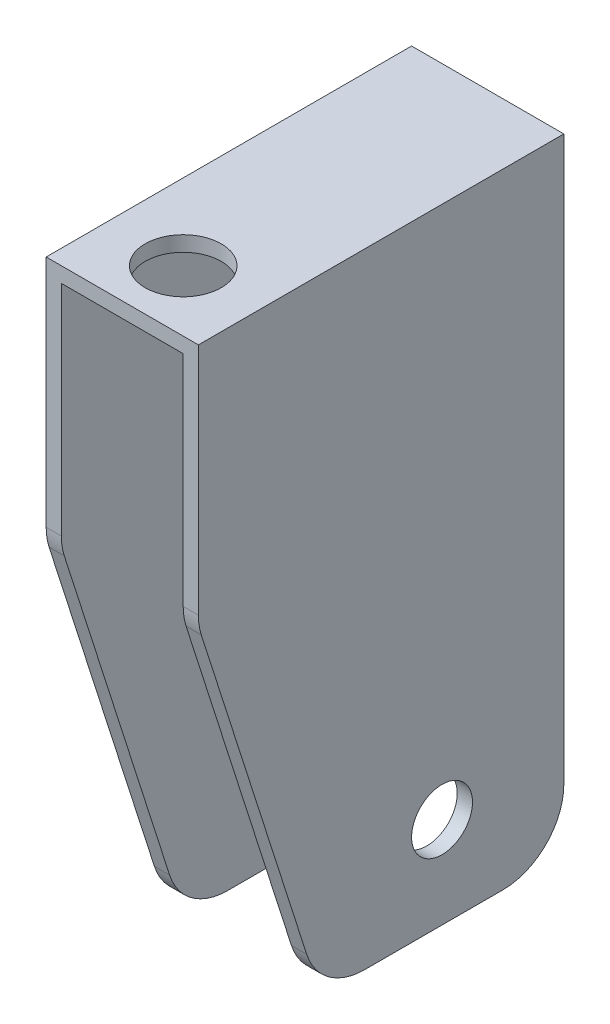
ISO-10303-21;
HEADER;
FILE_DESCRIPTION(('STEP AP214'),'2;1');
FILE_NAME('part.step','',(''),(''),'','','');
FILE_SCHEMA(('AUTOMOTIVE_DESIGN { 1 0 10303 214 1 1 1 1 }'));
ENDSEC;
DATA;
#1=APPLICATION_CONTEXT('core data for automotive mechanical design processes');
#2=APPLICATION_PROTOCOL_DEFINITION('international standard','automotive_design',2000,#1);
#3=PRODUCT_CONTEXT('',#1,'mechanical');
#4=PRODUCT('Part','Part','',(#3));
#5=PRODUCT_RELATED_PRODUCT_CATEGORY('part','',(#4));
#6=PRODUCT_DEFINITION_FORMATION('','',#4);
#7=PRODUCT_DEFINITION_CONTEXT('part definition',#1,'design');
#8=PRODUCT_DEFINITION('design','',#6,#7);
#9=PRODUCT_DEFINITION_SHAPE('','',#8);
#10=(LENGTH_UNIT() NAMED_UNIT(*) SI_UNIT(.MILLI.,.METRE.));
#11=(NAMED_UNIT(*) PLANE_ANGLE_UNIT() SI_UNIT($,.RADIAN.));
#12=(NAMED_UNIT(*) SI_UNIT($,.STERADIAN.) SOLID_ANGLE_UNIT());
#13=UNCERTAINTY_MEASURE_WITH_UNIT(LENGTH_MEASURE(1.E-05),#10,'distance_accuracy_value','');
#14=(GEOMETRIC_REPRESENTATION_CONTEXT(3) GLOBAL_UNCERTAINTY_ASSIGNED_CONTEXT((#13)) GLOBAL_UNIT_ASSIGNED_CONTEXT((#10,
#11,#12)) REPRESENTATION_CONTEXT('',''));
#15=CARTESIAN_POINT('',(0.,0.,0.));
#16=DIRECTION('',(0.,0.,1.));
#17=DIRECTION('',(1.,0.,0.));
#18=AXIS2_PLACEMENT_3D('',#15,#16,#17);
#19=CARTESIAN_POINT('',(0.,0.,120.));
#20=DIRECTION('',(0.,1.,0.));
#21=DIRECTION('',(0.,0.,1.));
#22=AXIS2_PLACEMENT_3D('',#19,#20,#21);
#23=PLANE('',#22);
#24=DIRECTION('',(0.,0.,-1.));
#25=VECTOR('',#24,1.);
#26=CARTESIAN_POINT('',(5.,0.,120.));
#27=LINE('',#26,#25);
#28=CARTESIAN_POINT('',(5.,0.,65.4009524025493));
#29=VERTEX_POINT('',#28);
#30=CARTESIAN_POINT('',(5.,0.,20.));
#31=VERTEX_POINT('',#30);
#32=EDGE_CURVE('E165',#29,#31,#27,.T.);
#33=ORIENTED_EDGE('',*,*,#32,.F.);
#34=DIRECTION('',(1.,0.,0.));
#35=VECTOR('',#34,1.);
#36=CARTESIAN_POINT('',(0.,0.,65.4009524025493));
#37=LINE('',#36,#35);
#38=CARTESIAN_POINT('',(0.,0.,65.4009524025493));
#39=VERTEX_POINT('',#38);
#40=EDGE_CURVE('E260',#29,#39,#37,.F.);
#41=ORIENTED_EDGE('',*,*,#40,.T.);
#42=DIRECTION('',(0.,0.,-1.));
#43=VECTOR('',#42,1.);
#44=CARTESIAN_POINT('',(0.,0.,120.));
#45=LINE('',#44,#43);
#46=CARTESIAN_POINT('',(0.,0.,20.));
#47=VERTEX_POINT('',#46);
#48=EDGE_CURVE('E234',#39,#47,#45,.T.);
#49=ORIENTED_EDGE('',*,*,#48,.T.);
#50=DIRECTION('',(1.,0.,0.));
#51=VECTOR('',#50,1.);
#52=CARTESIAN_POINT('',(0.,0.,20.));
#53=LINE('',#52,#51);
#54=EDGE_CURVE('E262',#47,#31,#53,.T.);
#55=ORIENTED_EDGE('',*,*,#54,.T.);
#56=EDGE_LOOP('',(#33,#41,#49,#55));
#57=FACE_BOUND('',#56,.T.);
#58=ADVANCED_FACE('F33',(#57),#23,.F.);
#59=CARTESIAN_POINT('',(5.,0.,120.));
#60=DIRECTION('',(-1.,0.,0.));
#61=DIRECTION('',(0.,0.,1.));
#62=AXIS2_PLACEMENT_3D('',#59,#60,#61);
#63=PLANE('',#62);
#64=CARTESIAN_POINT('',(5.,30.,40.));
#65=DIRECTION('',(-1.,0.,0.));
#66=DIRECTION('',(0.,0.,1.));
#67=AXIS2_PLACEMENT_3D('',#64,#65,#66);
#68=CIRCLE('',#67,10.);
#69=CARTESIAN_POINT('',(5.,30.,50.));
#70=VERTEX_POINT('',#69);
#71=EDGE_CURVE('E324',#70,#70,#68,.T.);
#72=ORIENTED_EDGE('',*,*,#71,.T.);
#73=EDGE_LOOP('',(#72));
#74=FACE_BOUND('',#73,.T.);
#75=DIRECTION('',(0.,1.,0.));
#76=VECTOR('',#75,1.);
#77=CARTESIAN_POINT('',(5.,0.,120.));
#78=LINE('',#77,#76);
#79=CARTESIAN_POINT('',(5.,128.122023742033,120.));
#80=VERTEX_POINT('',#79);
#81=CARTESIAN_POINT('',(5.,200.,120.));
#82=VERTEX_POINT('',#81);
#83=EDGE_CURVE('E145',#80,#82,#78,.T.);
#84=ORIENTED_EDGE('',*,*,#83,.F.);
#85=CARTESIAN_POINT('',(5.,128.122023742033,100.));
#86=DIRECTION('',(-1.,0.,0.));
#87=DIRECTION('',(0.,0.,1.));
#88=AXIS2_PLACEMENT_3D('',#85,#86,#87);
#89=CIRCLE('',#88,20.);
#90=CARTESIAN_POINT('',(5.,122.026509199958,119.048482943986));
#91=VERTEX_POINT('',#90);
#92=EDGE_CURVE('E191',#80,#91,#89,.F.);
#93=ORIENTED_EDGE('',*,*,#92,.T.);
#94=DIRECTION('',(0.,-0.952424147199324,-0.304775727103784));
#95=VECTOR('',#94,1.);
#96=CARTESIAN_POINT('',(5.,11.611030478955,83.7155297532656));
#97=LINE('',#96,#95);
#98=CARTESIAN_POINT('',(5.,13.9044854579243,84.4494353465358));
#99=VERTEX_POINT('',#98);
#100=EDGE_CURVE('E217',#91,#99,#97,.T.);
#101=ORIENTED_EDGE('',*,*,#100,.T.);
#102=CARTESIAN_POINT('',(5.,20.,65.4009524025493));
#103=DIRECTION('',(-1.,0.,0.));
#104=DIRECTION('',(0.,0.,1.));
#105=AXIS2_PLACEMENT_3D('',#102,#103,#104);
#106=CIRCLE('',#105,20.);
#107=EDGE_CURVE('E189',#99,#29,#106,.F.);
#108=ORIENTED_EDGE('',*,*,#107,.T.);
#109=ORIENTED_EDGE('',*,*,#32,.T.);
#110=CARTESIAN_POINT('',(5.,20.,20.));
#111=DIRECTION('',(-1.,0.,0.));
#112=DIRECTION('',(0.,0.,1.));
#113=AXIS2_PLACEMENT_3D('',#110,#111,#112);
#114=CIRCLE('',#113,20.);
#115=CARTESIAN_POINT('',(5.,20.,0.));
#116=VERTEX_POINT('',#115);
#117=EDGE_CURVE('E187',#31,#116,#114,.F.);
#118=ORIENTED_EDGE('',*,*,#117,.T.);
#119=DIRECTION('',(0.,1.,0.));
#120=VECTOR('',#119,1.);
#121=CARTESIAN_POINT('',(5.,0.,0.));
#122=LINE('',#121,#120);
#123=CARTESIAN_POINT('',(5.,200.,0.));
#124=VERTEX_POINT('',#123);
#125=EDGE_CURVE('E162',#116,#124,#122,.T.);
#126=ORIENTED_EDGE('',*,*,#125,.T.);
#127=DIRECTION('',(0.,0.,-1.));
#128=VECTOR('',#127,1.);
#129=CARTESIAN_POINT('',(5.,200.,120.));
#130=LINE('',#129,#128);
#131=EDGE_CURVE('E159',#82,#124,#130,.T.);
#132=ORIENTED_EDGE('',*,*,#131,.F.);
#133=EDGE_LOOP('',(#84,#93,#101,#108,#109,#118,#126,#132));
#134=FACE_BOUND('',#133,.T.);
#135=ADVANCED_FACE('F160',(#74,#134),#63,.F.);
#136=CARTESIAN_POINT('',(5.,200.,120.));
#137=DIRECTION('',(0.,1.,0.));
#138=DIRECTION('',(0.,0.,1.));
#139=AXIS2_PLACEMENT_3D('',#136,#137,#138);
#140=PLANE('',#139);
#141=CARTESIAN_POINT('',(25.,200.,100.));
#142=DIRECTION('',(0.,1.,0.));
#143=DIRECTION('',(0.,0.,1.));
#144=AXIS2_PLACEMENT_3D('',#141,#142,#143);
#145=CIRCLE('',#144,12.5);
#146=CARTESIAN_POINT('',(25.,200.,112.5));
#147=VERTEX_POINT('',#146);
#148=EDGE_CURVE('E338',#147,#147,#145,.F.);
#149=ORIENTED_EDGE('',*,*,#148,.F.);
#150=EDGE_LOOP('',(#149));
#151=FACE_BOUND('',#150,.T.);
#152=DIRECTION('',(1.,0.,0.));
#153=VECTOR('',#152,1.);
#154=CARTESIAN_POINT('',(5.,200.,0.));
#155=LINE('',#154,#153);
#156=CARTESIAN_POINT('',(44.9999999999999,200.,0.));
#157=VERTEX_POINT('',#156);
#158=EDGE_CURVE('E220',#124,#157,#155,.T.);
#159=ORIENTED_EDGE('',*,*,#158,.T.);
#160=DIRECTION('',(0.,0.,-1.));
#161=VECTOR('',#160,1.);
#162=CARTESIAN_POINT('',(44.9999999999999,200.,120.));
#163=LINE('',#162,#161);
#164=CARTESIAN_POINT('',(44.9999999999999,200.,120.));
#165=VERTEX_POINT('',#164);
#166=EDGE_CURVE('E166',#165,#157,#163,.T.);
#167=ORIENTED_EDGE('',*,*,#166,.F.);
#168=DIRECTION('',(1.,0.,0.));
#169=VECTOR('',#168,1.);
#170=CARTESIAN_POINT('',(5.,200.,120.));
#171=LINE('',#170,#169);
#172=EDGE_CURVE('E151',#82,#165,#171,.T.);
#173=ORIENTED_EDGE('',*,*,#172,.F.);
#174=ORIENTED_EDGE('',*,*,#131,.T.);
#175=EDGE_LOOP('',(#159,#167,#173,#174));
#176=FACE_BOUND('',#175,.T.);
#177=ADVANCED_FACE('F168',(#151,#176),#140,.F.);
#178=CARTESIAN_POINT('',(45.,0.,120.));
#179=DIRECTION('',(1.,0.,0.));
#180=DIRECTION('',(0.,1.,0.));
#181=AXIS2_PLACEMENT_3D('',#178,#179,#180);
#182=PLANE('',#181);
#183=CARTESIAN_POINT('',(45.,30.,40.));
#184=DIRECTION('',(1.,0.,0.));
#185=DIRECTION('',(0.,1.,0.));
#186=AXIS2_PLACEMENT_3D('',#183,#184,#185);
#187=CIRCLE('',#186,10.);
#188=CARTESIAN_POINT('',(45.,40.,40.));
#189=VERTEX_POINT('',#188);
#190=EDGE_CURVE('E326',#189,#189,#187,.T.);
#191=ORIENTED_EDGE('',*,*,#190,.T.);
#192=EDGE_LOOP('',(#191));
#193=FACE_BOUND('',#192,.T.);
#194=DIRECTION('',(0.,0.952424147199324,0.304775727103784));
#195=VECTOR('',#194,1.);
#196=CARTESIAN_POINT('',(45.,11.611030478955,83.7155297532656));
#197=LINE('',#196,#195);
#198=CARTESIAN_POINT('',(45.,13.9044854579243,84.4494353465358));
#199=VERTEX_POINT('',#198);
#200=CARTESIAN_POINT('',(45.,122.026509199958,119.048482943986));
#201=VERTEX_POINT('',#200);
#202=EDGE_CURVE('E209',#199,#201,#197,.T.);
#203=ORIENTED_EDGE('',*,*,#202,.T.);
#204=CARTESIAN_POINT('',(45.,128.122023742033,100.));
#205=DIRECTION('',(1.,0.,0.));
#206=DIRECTION('',(0.,1.,0.));
#207=AXIS2_PLACEMENT_3D('',#204,#205,#206);
#208=CIRCLE('',#207,20.);
#209=CARTESIAN_POINT('',(45.,128.122023742033,120.));
#210=VERTEX_POINT('',#209);
#211=EDGE_CURVE('E270',#201,#210,#208,.F.);
#212=ORIENTED_EDGE('',*,*,#211,.T.);
#213=DIRECTION('',(0.,-1.,0.));
#214=VECTOR('',#213,1.);
#215=CARTESIAN_POINT('',(45.,0.,120.));
#216=LINE('',#215,#214);
#217=EDGE_CURVE('E171',#165,#210,#216,.T.);
#218=ORIENTED_EDGE('',*,*,#217,.F.);
#219=ORIENTED_EDGE('',*,*,#166,.T.);
#220=DIRECTION('',(0.,-1.,0.));
#221=VECTOR('',#220,1.);
#222=CARTESIAN_POINT('',(45.,0.,0.));
#223=LINE('',#222,#221);
#224=CARTESIAN_POINT('',(45.,20.,0.));
#225=VERTEX_POINT('',#224);
#226=EDGE_CURVE('E222',#157,#225,#223,.T.);
#227=ORIENTED_EDGE('',*,*,#226,.T.);
#228=CARTESIAN_POINT('',(45.,20.,20.));
#229=DIRECTION('',(1.,0.,0.));
#230=DIRECTION('',(0.,1.,0.));
#231=AXIS2_PLACEMENT_3D('',#228,#229,#230);
#232=CIRCLE('',#231,20.);
#233=CARTESIAN_POINT('',(45.,0.,20.));
#234=VERTEX_POINT('',#233);
#235=EDGE_CURVE('E274',#225,#234,#232,.F.);
#236=ORIENTED_EDGE('',*,*,#235,.T.);
#237=DIRECTION('',(0.,0.,-1.));
#238=VECTOR('',#237,1.);
#239=CARTESIAN_POINT('',(45.,0.,120.));
#240=LINE('',#239,#238);
#241=CARTESIAN_POINT('',(45.,0.,65.4009524025493));
#242=VERTEX_POINT('',#241);
#243=EDGE_CURVE('E245',#242,#234,#240,.T.);
#244=ORIENTED_EDGE('',*,*,#243,.F.);
#245=CARTESIAN_POINT('',(45.,20.,65.4009524025493));
#246=DIRECTION('',(1.,0.,0.));
#247=DIRECTION('',(0.,1.,0.));
#248=AXIS2_PLACEMENT_3D('',#245,#246,#247);
#249=CIRCLE('',#248,20.);
#250=EDGE_CURVE('E272',#242,#199,#249,.F.);
#251=ORIENTED_EDGE('',*,*,#250,.T.);
#252=EDGE_LOOP('',(#203,#212,#218,#219,#227,#236,#244,#251));
#253=FACE_BOUND('',#252,.T.);
#254=ADVANCED_FACE('F250',(#193,#253),#182,.F.);
#255=CARTESIAN_POINT('',(50.,0.,120.));
#256=DIRECTION('',(0.,1.,0.));
#257=DIRECTION('',(-1.,0.,0.));
#258=AXIS2_PLACEMENT_3D('',#255,#256,#257);
#259=PLANE('',#258);
#260=DIRECTION('',(0.,0.,-1.));
#261=VECTOR('',#260,1.);
#262=CARTESIAN_POINT('',(50.,0.,120.));
#263=LINE('',#262,#261);
#264=CARTESIAN_POINT('',(50.,0.,65.4009524025493));
#265=VERTEX_POINT('',#264);
#266=CARTESIAN_POINT('',(50.,0.,20.));
#267=VERTEX_POINT('',#266);
#268=EDGE_CURVE('E243',#265,#267,#263,.T.);
#269=ORIENTED_EDGE('',*,*,#268,.F.);
#270=DIRECTION('',(1.,0.,0.));
#271=VECTOR('',#270,1.);
#272=CARTESIAN_POINT('',(50.,0.,65.4009524025493));
#273=LINE('',#272,#271);
#274=EDGE_CURVE('E255',#265,#242,#273,.F.);
#275=ORIENTED_EDGE('',*,*,#274,.T.);
#276=ORIENTED_EDGE('',*,*,#243,.T.);
#277=DIRECTION('',(1.,0.,0.));
#278=VECTOR('',#277,1.);
#279=CARTESIAN_POINT('',(50.,0.,20.));
#280=LINE('',#279,#278);
#281=EDGE_CURVE('E256',#234,#267,#280,.T.);
#282=ORIENTED_EDGE('',*,*,#281,.T.);
#283=EDGE_LOOP('',(#269,#275,#276,#282));
#284=FACE_BOUND('',#283,.T.);
#285=ADVANCED_FACE('F356',(#284),#259,.F.);
#286=CARTESIAN_POINT('',(50.,0.,120.));
#287=DIRECTION('',(-1.,0.,0.));
#288=DIRECTION('',(0.,-1.,0.));
#289=AXIS2_PLACEMENT_3D('',#286,#287,#288);
#290=PLANE('',#289);
#291=CARTESIAN_POINT('',(50.,30.,40.));
#292=DIRECTION('',(-1.,0.,0.));
#293=DIRECTION('',(0.,-1.,0.));
#294=AXIS2_PLACEMENT_3D('',#291,#292,#293);
#295=CIRCLE('',#294,10.);
#296=CARTESIAN_POINT('',(50.,20.,40.));
#297=VERTEX_POINT('',#296);
#298=EDGE_CURVE('E330',#297,#297,#295,.T.);
#299=ORIENTED_EDGE('',*,*,#298,.T.);
#300=EDGE_LOOP('',(#299));
#301=FACE_BOUND('',#300,.T.);
#302=DIRECTION('',(0.,1.,0.));
#303=VECTOR('',#302,1.);
#304=CARTESIAN_POINT('',(50.,0.,120.));
#305=LINE('',#304,#303);
#306=CARTESIAN_POINT('',(50.,128.122023742033,120.));
#307=VERTEX_POINT('',#306);
#308=CARTESIAN_POINT('',(50.,205.,120.));
#309=VERTEX_POINT('',#308);
#310=EDGE_CURVE('E173',#307,#309,#305,.T.);
#311=ORIENTED_EDGE('',*,*,#310,.F.);
#312=CARTESIAN_POINT('',(50.,128.122023742033,100.));
#313=DIRECTION('',(-1.,0.,0.));
#314=DIRECTION('',(0.,-1.,0.));
#315=AXIS2_PLACEMENT_3D('',#312,#313,#314);
#316=CIRCLE('',#315,20.);
#317=CARTESIAN_POINT('',(50.,122.026509199958,119.048482943986));
#318=VERTEX_POINT('',#317);
#319=EDGE_CURVE('E265',#307,#318,#316,.F.);
#320=ORIENTED_EDGE('',*,*,#319,.T.);
#321=DIRECTION('',(0.,-0.952424147199324,-0.304775727103784));
#322=VECTOR('',#321,1.);
#323=CARTESIAN_POINT('',(50.,11.611030478955,83.7155297532656));
#324=LINE('',#323,#322);
#325=CARTESIAN_POINT('',(50.,13.9044854579243,84.4494353465358));
#326=VERTEX_POINT('',#325);
#327=EDGE_CURVE('E205',#318,#326,#324,.T.);
#328=ORIENTED_EDGE('',*,*,#327,.T.);
#329=CARTESIAN_POINT('',(50.,20.,65.4009524025493));
#330=DIRECTION('',(-1.,0.,0.));
#331=DIRECTION('',(0.,-1.,0.));
#332=AXIS2_PLACEMENT_3D('',#329,#330,#331);
#333=CIRCLE('',#332,20.);
#334=EDGE_CURVE('E267',#326,#265,#333,.F.);
#335=ORIENTED_EDGE('',*,*,#334,.T.);
#336=ORIENTED_EDGE('',*,*,#268,.T.);
#337=CARTESIAN_POINT('',(50.,20.,20.));
#338=DIRECTION('',(-1.,0.,0.));
#339=DIRECTION('',(0.,-1.,0.));
#340=AXIS2_PLACEMENT_3D('',#337,#338,#339);
#341=CIRCLE('',#340,20.);
#342=CARTESIAN_POINT('',(50.,20.,0.));
#343=VERTEX_POINT('',#342);
#344=EDGE_CURVE('E48',#267,#343,#341,.F.);
#345=ORIENTED_EDGE('',*,*,#344,.T.);
#346=DIRECTION('',(0.,1.,0.));
#347=VECTOR('',#346,1.);
#348=CARTESIAN_POINT('',(50.,0.,0.));
#349=LINE('',#348,#347);
#350=CARTESIAN_POINT('',(50.,205.,0.));
#351=VERTEX_POINT('',#350);
#352=EDGE_CURVE('E228',#343,#351,#349,.T.);
#353=ORIENTED_EDGE('',*,*,#352,.T.);
#354=DIRECTION('',(0.,0.,-1.));
#355=VECTOR('',#354,1.);
#356=CARTESIAN_POINT('',(50.,205.,120.));
#357=LINE('',#356,#355);
#358=EDGE_CURVE('E240',#309,#351,#357,.T.);
#359=ORIENTED_EDGE('',*,*,#358,.F.);
#360=EDGE_LOOP('',(#311,#320,#328,#335,#336,#345,#353,#359));
#361=FACE_BOUND('',#360,.T.);
#362=ADVANCED_FACE('F287',(#301,#361),#290,.F.);
#363=CARTESIAN_POINT('',(0.,205.,120.));
#364=DIRECTION('',(0.,-1.,0.));
#365=DIRECTION('',(0.,0.,-1.));
#366=AXIS2_PLACEMENT_3D('',#363,#364,#365);
#367=PLANE('',#366);
#368=CARTESIAN_POINT('',(25.,205.,100.));
#369=DIRECTION('',(0.,1.,0.));
#370=DIRECTION('',(0.,0.,1.));
#371=AXIS2_PLACEMENT_3D('',#368,#369,#370);
#372=CIRCLE('',#371,12.5);
#373=CARTESIAN_POINT('',(25.,205.,112.5));
#374=VERTEX_POINT('',#373);
#375=EDGE_CURVE('E341',#374,#374,#372,.T.);
#376=ORIENTED_EDGE('',*,*,#375,.F.);
#377=EDGE_LOOP('',(#376));
#378=FACE_BOUND('',#377,.T.);
#379=DIRECTION('',(-1.,0.,0.));
#380=VECTOR('',#379,1.);
#381=CARTESIAN_POINT('',(0.,205.,0.));
#382=LINE('',#381,#380);
#383=CARTESIAN_POINT('',(0.,205.,0.));
#384=VERTEX_POINT('',#383);
#385=EDGE_CURVE('E230',#351,#384,#382,.T.);
#386=ORIENTED_EDGE('',*,*,#385,.T.);
#387=DIRECTION('',(0.,0.,-1.));
#388=VECTOR('',#387,1.);
#389=CARTESIAN_POINT('',(0.,205.,120.));
#390=LINE('',#389,#388);
#391=CARTESIAN_POINT('',(0.,205.,120.));
#392=VERTEX_POINT('',#391);
#393=EDGE_CURVE('E237',#392,#384,#390,.T.);
#394=ORIENTED_EDGE('',*,*,#393,.F.);
#395=DIRECTION('',(-1.,0.,0.));
#396=VECTOR('',#395,1.);
#397=CARTESIAN_POINT('',(0.,205.,120.));
#398=LINE('',#397,#396);
#399=EDGE_CURVE('E179',#309,#392,#398,.T.);
#400=ORIENTED_EDGE('',*,*,#399,.F.);
#401=ORIENTED_EDGE('',*,*,#358,.T.);
#402=EDGE_LOOP('',(#386,#394,#400,#401));
#403=FACE_BOUND('',#402,.T.);
#404=ADVANCED_FACE('F297',(#378,#403),#367,.F.);
#405=CARTESIAN_POINT('',(0.,0.,120.));
#406=DIRECTION('',(1.,0.,0.));
#407=DIRECTION('',(0.,0.,-1.));
#408=AXIS2_PLACEMENT_3D('',#405,#406,#407);
#409=PLANE('',#408);
#410=CARTESIAN_POINT('',(0.,30.,40.));
#411=DIRECTION('',(1.,0.,0.));
#412=DIRECTION('',(0.,1.,0.));
#413=AXIS2_PLACEMENT_3D('',#410,#411,#412);
#414=CIRCLE('',#413,10.);
#415=CARTESIAN_POINT('',(0.,40.,40.));
#416=VERTEX_POINT('',#415);
#417=EDGE_CURVE('E335',#416,#416,#414,.T.);
#418=ORIENTED_EDGE('',*,*,#417,.T.);
#419=EDGE_LOOP('',(#418));
#420=FACE_BOUND('',#419,.T.);
#421=DIRECTION('',(0.,0.952424147199324,0.304775727103784));
#422=VECTOR('',#421,1.);
#423=CARTESIAN_POINT('',(0.,0.,80.));
#424=LINE('',#423,#422);
#425=CARTESIAN_POINT('',(0.,13.9044854579243,84.4494353465358));
#426=VERTEX_POINT('',#425);
#427=CARTESIAN_POINT('',(0.,122.026509199958,119.048482943986));
#428=VERTEX_POINT('',#427);
#429=EDGE_CURVE('E210',#426,#428,#424,.T.);
#430=ORIENTED_EDGE('',*,*,#429,.T.);
#431=CARTESIAN_POINT('',(0.,128.122023742033,100.));
#432=DIRECTION('',(1.,0.,0.));
#433=DIRECTION('',(0.,0.,-1.));
#434=AXIS2_PLACEMENT_3D('',#431,#432,#433);
#435=CIRCLE('',#434,20.);
#436=CARTESIAN_POINT('',(0.,128.122023742033,120.));
#437=VERTEX_POINT('',#436);
#438=EDGE_CURVE('E202',#428,#437,#435,.F.);
#439=ORIENTED_EDGE('',*,*,#438,.T.);
#440=DIRECTION('',(0.,-1.,0.));
#441=VECTOR('',#440,1.);
#442=CARTESIAN_POINT('',(0.,0.,120.));
#443=LINE('',#442,#441);
#444=EDGE_CURVE('E224',#392,#437,#443,.T.);
#445=ORIENTED_EDGE('',*,*,#444,.F.);
#446=ORIENTED_EDGE('',*,*,#393,.T.);
#447=DIRECTION('',(0.,-1.,0.));
#448=VECTOR('',#447,1.);
#449=CARTESIAN_POINT('',(0.,0.,0.));
#450=LINE('',#449,#448);
#451=CARTESIAN_POINT('',(0.,20.,0.));
#452=VERTEX_POINT('',#451);
#453=EDGE_CURVE('E156',#384,#452,#450,.T.);
#454=ORIENTED_EDGE('',*,*,#453,.T.);
#455=CARTESIAN_POINT('',(0.,20.,20.));
#456=DIRECTION('',(1.,0.,0.));
#457=DIRECTION('',(0.,0.,-1.));
#458=AXIS2_PLACEMENT_3D('',#455,#456,#457);
#459=CIRCLE('',#458,20.);
#460=EDGE_CURVE('E198',#452,#47,#459,.F.);
#461=ORIENTED_EDGE('',*,*,#460,.T.);
#462=ORIENTED_EDGE('',*,*,#48,.F.);
#463=CARTESIAN_POINT('',(0.,20.,65.4009524025493));
#464=DIRECTION('',(1.,0.,0.));
#465=DIRECTION('',(0.,0.,-1.));
#466=AXIS2_PLACEMENT_3D('',#463,#464,#465);
#467=CIRCLE('',#466,20.);
#468=EDGE_CURVE('E200',#39,#426,#467,.F.);
#469=ORIENTED_EDGE('',*,*,#468,.T.);
#470=EDGE_LOOP('',(#430,#439,#445,#446,#454,#461,#462,#469));
#471=FACE_BOUND('',#470,.T.);
#472=ADVANCED_FACE('F323',(#420,#471),#409,.F.);
#473=CARTESIAN_POINT('',(0.,0.,120.));
#474=DIRECTION('',(0.,0.,1.));
#475=DIRECTION('',(1.,0.,0.));
#476=AXIS2_PLACEMENT_3D('',#473,#474,#475);
#477=PLANE('',#476);
#478=ORIENTED_EDGE('',*,*,#444,.T.);
#479=DIRECTION('',(1.,0.,0.));
#480=VECTOR('',#479,1.);
#481=CARTESIAN_POINT('',(5.,128.122023742033,120.));
#482=LINE('',#481,#480);
#483=EDGE_CURVE('E154',#437,#80,#482,.T.);
#484=ORIENTED_EDGE('',*,*,#483,.T.);
#485=ORIENTED_EDGE('',*,*,#83,.T.);
#486=ORIENTED_EDGE('',*,*,#172,.T.);
#487=ORIENTED_EDGE('',*,*,#217,.T.);
#488=DIRECTION('',(-1.,0.,0.));
#489=VECTOR('',#488,1.);
#490=CARTESIAN_POINT('',(50.,128.122023742033,120.));
#491=LINE('',#490,#489);
#492=EDGE_CURVE('E184',#210,#307,#491,.F.);
#493=ORIENTED_EDGE('',*,*,#492,.T.);
#494=ORIENTED_EDGE('',*,*,#310,.T.);
#495=ORIENTED_EDGE('',*,*,#399,.T.);
#496=EDGE_LOOP('',(#478,#484,#485,#486,#487,#493,#494,#495));
#497=FACE_BOUND('',#496,.T.);
#498=ADVANCED_FACE('F148',(#497),#477,.T.);
#499=CARTESIAN_POINT('',(0.,0.,0.));
#500=DIRECTION('',(0.,0.,1.));
#501=DIRECTION('',(1.,0.,0.));
#502=AXIS2_PLACEMENT_3D('',#499,#500,#501);
#503=PLANE('',#502);
#504=ORIENTED_EDGE('',*,*,#125,.F.);
#505=DIRECTION('',(1.,0.,0.));
#506=VECTOR('',#505,1.);
#507=CARTESIAN_POINT('',(0.,20.,0.));
#508=LINE('',#507,#506);
#509=EDGE_CURVE('E11',#116,#452,#508,.F.);
#510=ORIENTED_EDGE('',*,*,#509,.T.);
#511=ORIENTED_EDGE('',*,*,#453,.F.);
#512=ORIENTED_EDGE('',*,*,#385,.F.);
#513=ORIENTED_EDGE('',*,*,#352,.F.);
#514=DIRECTION('',(1.,0.,0.));
#515=VECTOR('',#514,1.);
#516=CARTESIAN_POINT('',(0.,20.,0.));
#517=LINE('',#516,#515);
#518=EDGE_CURVE('E41',#343,#225,#517,.F.);
#519=ORIENTED_EDGE('',*,*,#518,.T.);
#520=ORIENTED_EDGE('',*,*,#226,.F.);
#521=ORIENTED_EDGE('',*,*,#158,.F.);
#522=EDGE_LOOP('',(#504,#510,#511,#512,#513,#519,#520,#521));
#523=FACE_BOUND('',#522,.T.);
#524=ADVANCED_FACE('F253',(#523),#503,.F.);
#525=CARTESIAN_POINT('',(0.,0.,80.));
#526=DIRECTION('',(0.,0.304775727103784,-0.952424147199324));
#527=DIRECTION('',(0.,0.952424147199324,0.304775727103784));
#528=AXIS2_PLACEMENT_3D('',#525,#526,#527);
#529=PLANE('',#528);
#530=ORIENTED_EDGE('',*,*,#100,.F.);
#531=DIRECTION('',(1.,0.,0.));
#532=VECTOR('',#531,1.);
#533=CARTESIAN_POINT('',(0.,122.026509199958,119.048482943986));
#534=LINE('',#533,#532);
#535=EDGE_CURVE('E196',#91,#428,#534,.F.);
#536=ORIENTED_EDGE('',*,*,#535,.T.);
#537=ORIENTED_EDGE('',*,*,#429,.F.);
#538=DIRECTION('',(1.,0.,0.));
#539=VECTOR('',#538,1.);
#540=CARTESIAN_POINT('',(0.,13.9044854579243,84.4494353465358));
#541=LINE('',#540,#539);
#542=EDGE_CURVE('E193',#426,#99,#541,.T.);
#543=ORIENTED_EDGE('',*,*,#542,.T.);
#544=EDGE_LOOP('',(#530,#536,#537,#543));
#545=FACE_BOUND('',#544,.T.);
#546=ADVANCED_FACE('F305',(#545),#529,.F.);
#547=ORIENTED_EDGE('',*,*,#327,.F.);
#548=DIRECTION('',(-1.,0.,0.));
#549=VECTOR('',#548,1.);
#550=CARTESIAN_POINT('',(45.,122.026509199958,119.048482943986));
#551=LINE('',#550,#549);
#552=EDGE_CURVE('E275',#318,#201,#551,.T.);
#553=ORIENTED_EDGE('',*,*,#552,.T.);
#554=ORIENTED_EDGE('',*,*,#202,.F.);
#555=DIRECTION('',(1.,0.,0.));
#556=VECTOR('',#555,1.);
#557=CARTESIAN_POINT('',(0.,13.9044854579243,84.4494353465358));
#558=LINE('',#557,#556);
#559=EDGE_CURVE('E204',#199,#326,#558,.T.);
#560=ORIENTED_EDGE('',*,*,#559,.T.);
#561=EDGE_LOOP('',(#547,#553,#554,#560));
#562=FACE_BOUND('',#561,.T.);
#563=ADVANCED_FACE('F283',(#562),#529,.F.);
#564=CARTESIAN_POINT('',(0.,30.,40.));
#565=DIRECTION('',(1.,0.,0.));
#566=DIRECTION('',(0.,1.,0.));
#567=AXIS2_PLACEMENT_3D('',#564,#565,#566);
#568=CYLINDRICAL_SURFACE('',#567,10.);
#569=ORIENTED_EDGE('',*,*,#417,.F.);
#570=EDGE_LOOP('',(#569));
#571=FACE_BOUND('',#570,.T.);
#572=ORIENTED_EDGE('',*,*,#71,.F.);
#573=EDGE_LOOP('',(#572));
#574=FACE_BOUND('',#573,.T.);
#575=ADVANCED_FACE('F457',(#571,#574),#568,.F.);
#576=ORIENTED_EDGE('',*,*,#298,.F.);
#577=EDGE_LOOP('',(#576));
#578=FACE_BOUND('',#577,.T.);
#579=ORIENTED_EDGE('',*,*,#190,.F.);
#580=EDGE_LOOP('',(#579));
#581=FACE_BOUND('',#580,.T.);
#582=ADVANCED_FACE('F369',(#578,#581),#568,.F.);
#583=CARTESIAN_POINT('',(0.,128.122023742033,100.));
#584=DIRECTION('',(-1.,0.,0.));
#585=DIRECTION('',(0.,-1.,0.));
#586=AXIS2_PLACEMENT_3D('',#583,#584,#585);
#587=CYLINDRICAL_SURFACE('',#586,20.);
#588=ORIENTED_EDGE('',*,*,#438,.F.);
#589=ORIENTED_EDGE('',*,*,#535,.F.);
#590=ORIENTED_EDGE('',*,*,#92,.F.);
#591=ORIENTED_EDGE('',*,*,#483,.F.);
#592=EDGE_LOOP('',(#588,#589,#590,#591));
#593=FACE_BOUND('',#592,.T.);
#594=ADVANCED_FACE('F302',(#593),#587,.T.);
#595=CARTESIAN_POINT('',(0.,128.122023742033,100.));
#596=DIRECTION('',(1.,0.,0.));
#597=DIRECTION('',(0.,1.,0.));
#598=AXIS2_PLACEMENT_3D('',#595,#596,#597);
#599=CYLINDRICAL_SURFACE('',#598,20.);
#600=ORIENTED_EDGE('',*,*,#319,.F.);
#601=ORIENTED_EDGE('',*,*,#492,.F.);
#602=ORIENTED_EDGE('',*,*,#211,.F.);
#603=ORIENTED_EDGE('',*,*,#552,.F.);
#604=EDGE_LOOP('',(#600,#601,#602,#603));
#605=FACE_BOUND('',#604,.T.);
#606=ADVANCED_FACE('F293',(#605),#599,.T.);
#607=CARTESIAN_POINT('',(0.,20.,65.4009524025493));
#608=DIRECTION('',(1.,0.,0.));
#609=DIRECTION('',(0.,0.,-1.));
#610=AXIS2_PLACEMENT_3D('',#607,#608,#609);
#611=CYLINDRICAL_SURFACE('',#610,20.);
#612=ORIENTED_EDGE('',*,*,#468,.F.);
#613=ORIENTED_EDGE('',*,*,#40,.F.);
#614=ORIENTED_EDGE('',*,*,#107,.F.);
#615=ORIENTED_EDGE('',*,*,#542,.F.);
#616=EDGE_LOOP('',(#612,#613,#614,#615));
#617=FACE_BOUND('',#616,.T.);
#618=ADVANCED_FACE('F311',(#617),#611,.T.);
#619=CARTESIAN_POINT('',(0.,20.,65.4009524025493));
#620=DIRECTION('',(1.,0.,0.));
#621=DIRECTION('',(0.,1.,0.));
#622=AXIS2_PLACEMENT_3D('',#619,#620,#621);
#623=CYLINDRICAL_SURFACE('',#622,20.);
#624=ORIENTED_EDGE('',*,*,#250,.F.);
#625=ORIENTED_EDGE('',*,*,#274,.F.);
#626=ORIENTED_EDGE('',*,*,#334,.F.);
#627=ORIENTED_EDGE('',*,*,#559,.F.);
#628=EDGE_LOOP('',(#624,#625,#626,#627));
#629=FACE_BOUND('',#628,.T.);
#630=ADVANCED_FACE('F374',(#629),#623,.T.);
#631=CARTESIAN_POINT('',(0.,20.,20.));
#632=DIRECTION('',(1.,0.,0.));
#633=DIRECTION('',(0.,0.,-1.));
#634=AXIS2_PLACEMENT_3D('',#631,#632,#633);
#635=CYLINDRICAL_SURFACE('',#634,20.);
#636=ORIENTED_EDGE('',*,*,#460,.F.);
#637=ORIENTED_EDGE('',*,*,#509,.F.);
#638=ORIENTED_EDGE('',*,*,#117,.F.);
#639=ORIENTED_EDGE('',*,*,#54,.F.);
#640=EDGE_LOOP('',(#636,#637,#638,#639));
#641=FACE_BOUND('',#640,.T.);
#642=ADVANCED_FACE('F320',(#641),#635,.T.);
#643=CARTESIAN_POINT('',(50.,20.,20.));
#644=DIRECTION('',(1.,0.,0.));
#645=DIRECTION('',(0.,1.,0.));
#646=AXIS2_PLACEMENT_3D('',#643,#644,#645);
#647=CYLINDRICAL_SURFACE('',#646,20.);
#648=ORIENTED_EDGE('',*,*,#235,.F.);
#649=ORIENTED_EDGE('',*,*,#518,.F.);
#650=ORIENTED_EDGE('',*,*,#344,.F.);
#651=ORIENTED_EDGE('',*,*,#281,.F.);
#652=EDGE_LOOP('',(#648,#649,#650,#651));
#653=FACE_BOUND('',#652,.T.);
#654=ADVANCED_FACE('F35',(#653),#647,.T.);
#655=CARTESIAN_POINT('',(25.,-0.001000000000001,100.));
#656=DIRECTION('',(0.,1.,0.));
#657=DIRECTION('',(0.,0.,1.));
#658=AXIS2_PLACEMENT_3D('',#655,#656,#657);
#659=CYLINDRICAL_SURFACE('',#658,12.5);
#660=ORIENTED_EDGE('',*,*,#375,.T.);
#661=EDGE_LOOP('',(#660));
#662=FACE_BOUND('',#661,.T.);
#663=ORIENTED_EDGE('',*,*,#148,.T.);
#664=EDGE_LOOP('',(#663));
#665=FACE_BOUND('',#664,.T.);
#666=ADVANCED_FACE('F345',(#662,#665),#659,.F.);
#667=CLOSED_SHELL('',(#58,#135,#177,#254,#285,#362,#404,#472,#498,#524,#546,#563,#575,#582,#594,
#606,#618,#630,#642,#654,#666));
#668=MANIFOLD_SOLID_BREP('B2',#667);
#669=ADVANCED_BREP_SHAPE_REPRESENTATION('',(#18,#668),#14);
#670=SHAPE_DEFINITION_REPRESENTATION(#9,#669);
ENDSEC;
END-ISO-10303-21;
